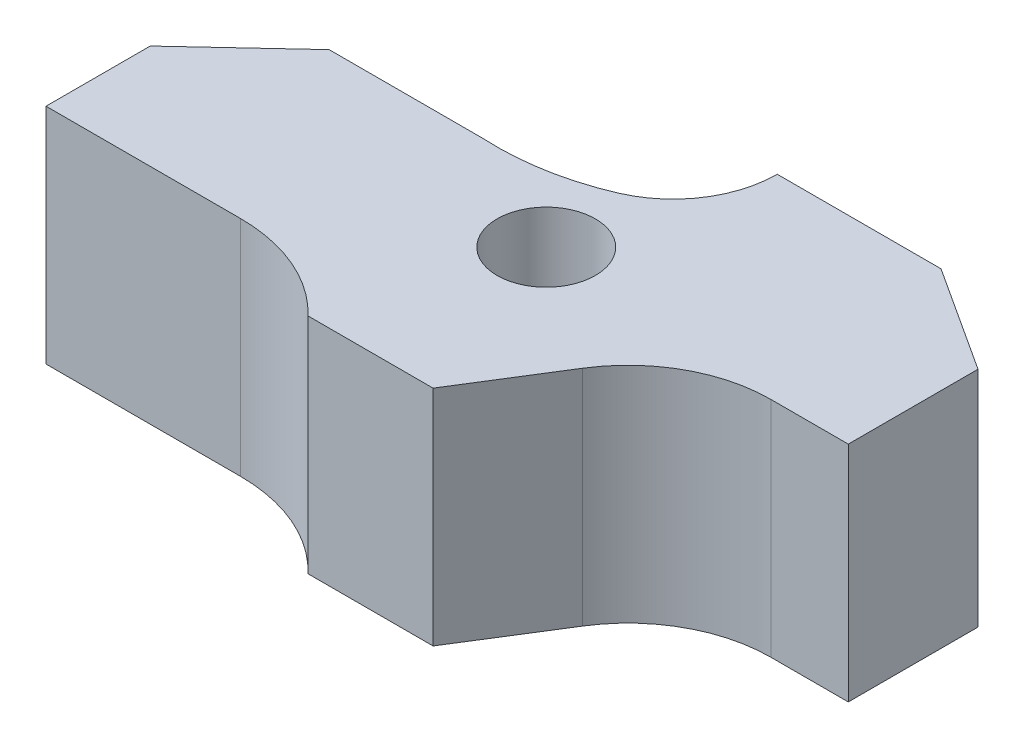
ISO-10303-21;
HEADER;
FILE_DESCRIPTION(('STEP AP214'),'2;1');
FILE_NAME('part.step','',(''),(''),'','','');
FILE_SCHEMA(('AUTOMOTIVE_DESIGN { 1 0 10303 214 1 1 1 1 }'));
ENDSEC;
DATA;
#1=APPLICATION_CONTEXT('core data for automotive mechanical design processes');
#2=APPLICATION_PROTOCOL_DEFINITION('international standard','automotive_design',2000,#1);
#3=PRODUCT_CONTEXT('',#1,'mechanical');
#4=PRODUCT('Part','Part','',(#3));
#5=PRODUCT_RELATED_PRODUCT_CATEGORY('part','',(#4));
#6=PRODUCT_DEFINITION_FORMATION('','',#4);
#7=PRODUCT_DEFINITION_CONTEXT('part definition',#1,'design');
#8=PRODUCT_DEFINITION('design','',#6,#7);
#9=PRODUCT_DEFINITION_SHAPE('','',#8);
#10=(LENGTH_UNIT() NAMED_UNIT(*) SI_UNIT(.MILLI.,.METRE.));
#11=(NAMED_UNIT(*) PLANE_ANGLE_UNIT() SI_UNIT($,.RADIAN.));
#12=(NAMED_UNIT(*) SI_UNIT($,.STERADIAN.) SOLID_ANGLE_UNIT());
#13=UNCERTAINTY_MEASURE_WITH_UNIT(LENGTH_MEASURE(1.E-05),#10,'distance_accuracy_value','');
#14=(GEOMETRIC_REPRESENTATION_CONTEXT(3) GLOBAL_UNCERTAINTY_ASSIGNED_CONTEXT((#13)) GLOBAL_UNIT_ASSIGNED_CONTEXT((#10,
#11,#12)) REPRESENTATION_CONTEXT('',''));
#15=CARTESIAN_POINT('',(0.,0.,0.));
#16=DIRECTION('',(0.,0.,1.));
#17=DIRECTION('',(1.,0.,0.));
#18=AXIS2_PLACEMENT_3D('',#15,#16,#17);
#19=CARTESIAN_POINT('',(87.5332669052182,75.,-149.728715079961));
#20=DIRECTION('',(0.,-1.,0.));
#21=DIRECTION('',(0.,0.,-1.));
#22=AXIS2_PLACEMENT_3D('',#19,#20,#21);
#23=CYLINDRICAL_SURFACE('',#22,85.8484892010049);
#24=CARTESIAN_POINT('',(87.5332669052182,0.,-149.728715079961));
#25=DIRECTION('',(0.,1.,0.));
#26=DIRECTION('',(0.,0.,1.));
#27=AXIS2_PLACEMENT_3D('',#24,#25,#26);
#28=CIRCLE('',#27,85.8484892010049);
#29=CARTESIAN_POINT('',(83.,0.,-64.));
#30=VERTEX_POINT('',#29);
#31=CARTESIAN_POINT('',(121.383798310515,0.,-70.8357203233028));
#32=VERTEX_POINT('',#31);
#33=EDGE_CURVE('E179',#30,#32,#28,.T.);
#34=ORIENTED_EDGE('',*,*,#33,.F.);
#35=DIRECTION('',(0.,-1.,0.));
#36=VECTOR('',#35,1.);
#37=CARTESIAN_POINT('',(83.,75.,-64.));
#38=LINE('',#37,#36);
#39=CARTESIAN_POINT('',(83.,75.,-64.));
#40=VERTEX_POINT('',#39);
#41=EDGE_CURVE('E11',#40,#30,#38,.T.);
#42=ORIENTED_EDGE('',*,*,#41,.F.);
#43=CARTESIAN_POINT('',(87.5332669052182,75.,-149.728715079961));
#44=DIRECTION('',(0.,1.,0.));
#45=DIRECTION('',(0.,0.,1.));
#46=AXIS2_PLACEMENT_3D('',#43,#44,#45);
#47=CIRCLE('',#46,85.8484892010049);
#48=CARTESIAN_POINT('',(121.383798310515,75.,-70.8357203233028));
#49=VERTEX_POINT('',#48);
#50=EDGE_CURVE('E220',#40,#49,#47,.T.);
#51=ORIENTED_EDGE('',*,*,#50,.T.);
#52=DIRECTION('',(0.,-1.,0.));
#53=VECTOR('',#52,1.);
#54=CARTESIAN_POINT('',(121.383798310515,75.,-70.8357203233028));
#55=LINE('',#54,#53);
#56=EDGE_CURVE('E61',#49,#32,#55,.T.);
#57=ORIENTED_EDGE('',*,*,#56,.T.);
#58=EDGE_LOOP('',(#34,#42,#51,#57));
#59=FACE_BOUND('',#58,.T.);
#60=ADVANCED_FACE('F45',(#59),#23,.F.);
#61=CARTESIAN_POINT('',(0.,75.,-64.));
#62=DIRECTION('',(0.,0.,1.));
#63=DIRECTION('',(1.,0.,0.));
#64=AXIS2_PLACEMENT_3D('',#61,#62,#63);
#65=PLANE('',#64);
#66=DIRECTION('',(-1.,0.,0.));
#67=VECTOR('',#66,1.);
#68=CARTESIAN_POINT('',(0.,0.,-64.));
#69=LINE('',#68,#67);
#70=CARTESIAN_POINT('',(31.0986925907159,0.,-64.));
#71=VERTEX_POINT('',#70);
#72=EDGE_CURVE('E181',#30,#71,#69,.T.);
#73=ORIENTED_EDGE('',*,*,#72,.T.);
#74=DIRECTION('',(0.,-1.,0.));
#75=VECTOR('',#74,1.);
#76=CARTESIAN_POINT('',(31.0986925907159,75.,-64.));
#77=LINE('',#76,#75);
#78=CARTESIAN_POINT('',(31.0986925907159,75.,-64.));
#79=VERTEX_POINT('',#78);
#80=EDGE_CURVE('E53',#79,#71,#77,.T.);
#81=ORIENTED_EDGE('',*,*,#80,.F.);
#82=DIRECTION('',(-1.,0.,0.));
#83=VECTOR('',#82,1.);
#84=CARTESIAN_POINT('',(0.,75.,-64.));
#85=LINE('',#84,#83);
#86=EDGE_CURVE('E261',#40,#79,#85,.T.);
#87=ORIENTED_EDGE('',*,*,#86,.F.);
#88=ORIENTED_EDGE('',*,*,#41,.T.);
#89=EDGE_LOOP('',(#73,#81,#87,#88));
#90=FACE_BOUND('',#89,.T.);
#91=ADVANCED_FACE('F248',(#90),#65,.F.);
#92=CARTESIAN_POINT('',(-17.4573708795469,75.,-18.7207382905222));
#93=DIRECTION('',(-0.681998360062497,0.,-0.731353701619171));
#94=DIRECTION('',(-0.731353701619171,0.,0.681998360062497));
#95=AXIS2_PLACEMENT_3D('',#92,#93,#94);
#96=PLANE('',#95);
#97=DIRECTION('',(0.731353701619171,0.,-0.681998360062497));
#98=VECTOR('',#97,1.);
#99=CARTESIAN_POINT('',(-17.4573708795469,0.,-18.7207382905222));
#100=LINE('',#99,#98);
#101=CARTESIAN_POINT('',(0.,0.,-35.));
#102=VERTEX_POINT('',#101);
#103=EDGE_CURVE('E184',#102,#71,#100,.T.);
#104=ORIENTED_EDGE('',*,*,#103,.F.);
#105=DIRECTION('',(0.,-1.,0.));
#106=VECTOR('',#105,1.);
#107=CARTESIAN_POINT('',(0.,75.,-35.));
#108=LINE('',#107,#106);
#109=CARTESIAN_POINT('',(0.,75.,-35.));
#110=VERTEX_POINT('',#109);
#111=EDGE_CURVE('E238',#110,#102,#108,.T.);
#112=ORIENTED_EDGE('',*,*,#111,.F.);
#113=DIRECTION('',(0.731353701619171,0.,-0.681998360062497));
#114=VECTOR('',#113,1.);
#115=CARTESIAN_POINT('',(-17.4573708795469,75.,-18.7207382905222));
#116=LINE('',#115,#114);
#117=EDGE_CURVE('E245',#110,#79,#116,.T.);
#118=ORIENTED_EDGE('',*,*,#117,.T.);
#119=ORIENTED_EDGE('',*,*,#80,.T.);
#120=EDGE_LOOP('',(#104,#112,#118,#119));
#121=FACE_BOUND('',#120,.T.);
#122=ADVANCED_FACE('F243',(#121),#96,.T.);
#123=CARTESIAN_POINT('',(0.,75.,0.));
#124=DIRECTION('',(-1.,0.,0.));
#125=DIRECTION('',(0.,0.,1.));
#126=AXIS2_PLACEMENT_3D('',#123,#124,#125);
#127=PLANE('',#126);
#128=DIRECTION('',(0.,0.,-1.));
#129=VECTOR('',#128,1.);
#130=CARTESIAN_POINT('',(0.,0.,0.));
#131=LINE('',#130,#129);
#132=CARTESIAN_POINT('',(0.,0.,0.));
#133=VERTEX_POINT('',#132);
#134=EDGE_CURVE('E187',#133,#102,#131,.T.);
#135=ORIENTED_EDGE('',*,*,#134,.F.);
#136=DIRECTION('',(0.,-1.,0.));
#137=VECTOR('',#136,1.);
#138=CARTESIAN_POINT('',(0.,75.,0.));
#139=LINE('',#138,#137);
#140=CARTESIAN_POINT('',(0.,75.,0.));
#141=VERTEX_POINT('',#140);
#142=EDGE_CURVE('E236',#141,#133,#139,.T.);
#143=ORIENTED_EDGE('',*,*,#142,.F.);
#144=DIRECTION('',(0.,0.,-1.));
#145=VECTOR('',#144,1.);
#146=CARTESIAN_POINT('',(0.,75.,0.));
#147=LINE('',#146,#145);
#148=EDGE_CURVE('E258',#141,#110,#147,.T.);
#149=ORIENTED_EDGE('',*,*,#148,.T.);
#150=ORIENTED_EDGE('',*,*,#111,.T.);
#151=EDGE_LOOP('',(#135,#143,#149,#150));
#152=FACE_BOUND('',#151,.T.);
#153=ADVANCED_FACE('F255',(#152),#127,.T.);
#154=CARTESIAN_POINT('',(0.,75.,0.));
#155=DIRECTION('',(0.,0.,1.));
#156=DIRECTION('',(1.,0.,0.));
#157=AXIS2_PLACEMENT_3D('',#154,#155,#156);
#158=PLANE('',#157);
#159=DIRECTION('',(-1.,0.,0.));
#160=VECTOR('',#159,1.);
#161=CARTESIAN_POINT('',(0.,0.,0.));
#162=LINE('',#161,#160);
#163=CARTESIAN_POINT('',(65.2382092958579,0.,0.));
#164=VERTEX_POINT('',#163);
#165=EDGE_CURVE('E190',#164,#133,#162,.T.);
#166=ORIENTED_EDGE('',*,*,#165,.F.);
#167=DIRECTION('',(0.,-1.,0.));
#168=VECTOR('',#167,1.);
#169=CARTESIAN_POINT('',(65.2382092958579,75.,0.));
#170=LINE('',#169,#168);
#171=CARTESIAN_POINT('',(65.2382092958579,75.,0.));
#172=VERTEX_POINT('',#171);
#173=EDGE_CURVE('E234',#172,#164,#170,.T.);
#174=ORIENTED_EDGE('',*,*,#173,.F.);
#175=DIRECTION('',(-1.,0.,0.));
#176=VECTOR('',#175,1.);
#177=CARTESIAN_POINT('',(0.,75.,0.));
#178=LINE('',#177,#176);
#179=EDGE_CURVE('E263',#172,#141,#178,.T.);
#180=ORIENTED_EDGE('',*,*,#179,.T.);
#181=ORIENTED_EDGE('',*,*,#142,.T.);
#182=EDGE_LOOP('',(#166,#174,#180,#181));
#183=FACE_BOUND('',#182,.T.);
#184=ADVANCED_FACE('F309',(#183),#158,.T.);
#185=CARTESIAN_POINT('',(65.2382092958579,75.,55.0000000000001));
#186=DIRECTION('',(0.,-1.,0.));
#187=DIRECTION('',(0.,0.,-1.));
#188=AXIS2_PLACEMENT_3D('',#185,#186,#187);
#189=CYLINDRICAL_SURFACE('',#188,55.);
#190=CARTESIAN_POINT('',(65.2382092958579,0.,55.0000000000001));
#191=DIRECTION('',(0.,1.,0.));
#192=DIRECTION('',(0.,0.,1.));
#193=AXIS2_PLACEMENT_3D('',#190,#191,#192);
#194=CIRCLE('',#193,55.);
#195=CARTESIAN_POINT('',(105.,0.,17.));
#196=VERTEX_POINT('',#195);
#197=EDGE_CURVE('E193',#196,#164,#194,.T.);
#198=ORIENTED_EDGE('',*,*,#197,.F.);
#199=DIRECTION('',(0.,-1.,0.));
#200=VECTOR('',#199,1.);
#201=CARTESIAN_POINT('',(105.,75.,17.));
#202=LINE('',#201,#200);
#203=CARTESIAN_POINT('',(105.,75.,17.));
#204=VERTEX_POINT('',#203);
#205=EDGE_CURVE('E232',#204,#196,#202,.T.);
#206=ORIENTED_EDGE('',*,*,#205,.F.);
#207=CARTESIAN_POINT('',(65.2382092958579,75.,55.0000000000001));
#208=DIRECTION('',(0.,1.,0.));
#209=DIRECTION('',(0.,0.,1.));
#210=AXIS2_PLACEMENT_3D('',#207,#208,#209);
#211=CIRCLE('',#210,55.);
#212=EDGE_CURVE('E269',#204,#172,#211,.T.);
#213=ORIENTED_EDGE('',*,*,#212,.T.);
#214=ORIENTED_EDGE('',*,*,#173,.T.);
#215=EDGE_LOOP('',(#198,#206,#213,#214));
#216=FACE_BOUND('',#215,.T.);
#217=ADVANCED_FACE('F312',(#216),#189,.F.);
#218=CARTESIAN_POINT('',(0.,75.,17.));
#219=DIRECTION('',(0.,0.,1.));
#220=DIRECTION('',(1.,0.,0.));
#221=AXIS2_PLACEMENT_3D('',#218,#219,#220);
#222=PLANE('',#221);
#223=DIRECTION('',(-1.,0.,0.));
#224=VECTOR('',#223,1.);
#225=CARTESIAN_POINT('',(0.,0.,17.));
#226=LINE('',#225,#224);
#227=CARTESIAN_POINT('',(147.,0.,17.));
#228=VERTEX_POINT('',#227);
#229=EDGE_CURVE('E196',#228,#196,#226,.T.);
#230=ORIENTED_EDGE('',*,*,#229,.F.);
#231=DIRECTION('',(0.,-1.,0.));
#232=VECTOR('',#231,1.);
#233=CARTESIAN_POINT('',(147.,75.,17.));
#234=LINE('',#233,#232);
#235=CARTESIAN_POINT('',(147.,75.,17.));
#236=VERTEX_POINT('',#235);
#237=EDGE_CURVE('E230',#236,#228,#234,.T.);
#238=ORIENTED_EDGE('',*,*,#237,.F.);
#239=DIRECTION('',(-1.,0.,0.));
#240=VECTOR('',#239,1.);
#241=CARTESIAN_POINT('',(0.,75.,17.));
#242=LINE('',#241,#240);
#243=EDGE_CURVE('E272',#236,#204,#242,.T.);
#244=ORIENTED_EDGE('',*,*,#243,.T.);
#245=ORIENTED_EDGE('',*,*,#205,.T.);
#246=EDGE_LOOP('',(#230,#238,#244,#245));
#247=FACE_BOUND('',#246,.T.);
#248=ADVANCED_FACE('F316',(#247),#222,.T.);
#249=CARTESIAN_POINT('',(113.360028682539,75.,70.8352076552825));
#250=DIRECTION('',(0.84804809615642,0.,0.529919264233214));
#251=DIRECTION('',(0.529919264233214,0.,-0.84804809615642));
#252=AXIS2_PLACEMENT_3D('',#249,#250,#251);
#253=PLANE('',#252);
#254=DIRECTION('',(-0.529919264233214,0.,0.84804809615642));
#255=VECTOR('',#254,1.);
#256=CARTESIAN_POINT('',(113.360028682539,0.,70.8352076552825));
#257=LINE('',#256,#255);
#258=CARTESIAN_POINT('',(166.293691384492,0.,-13.8763605152637));
#259=VERTEX_POINT('',#258);
#260=EDGE_CURVE('E199',#259,#228,#257,.T.);
#261=ORIENTED_EDGE('',*,*,#260,.F.);
#262=DIRECTION('',(0.,-1.,0.));
#263=VECTOR('',#262,1.);
#264=CARTESIAN_POINT('',(166.293691384492,75.,-13.8763605152637));
#265=LINE('',#264,#263);
#266=CARTESIAN_POINT('',(166.293691384492,75.,-13.8763605152637));
#267=VERTEX_POINT('',#266);
#268=EDGE_CURVE('E228',#267,#259,#265,.T.);
#269=ORIENTED_EDGE('',*,*,#268,.F.);
#270=DIRECTION('',(-0.529919264233214,0.,0.84804809615642));
#271=VECTOR('',#270,1.);
#272=CARTESIAN_POINT('',(113.360028682539,75.,70.8352076552825));
#273=LINE('',#272,#271);
#274=EDGE_CURVE('E275',#267,#236,#273,.T.);
#275=ORIENTED_EDGE('',*,*,#274,.T.);
#276=ORIENTED_EDGE('',*,*,#237,.T.);
#277=EDGE_LOOP('',(#261,#269,#275,#276));
#278=FACE_BOUND('',#277,.T.);
#279=ADVANCED_FACE('F320',(#278),#253,.T.);
#280=CARTESIAN_POINT('',(207.,75.,11.5597641679305));
#281=DIRECTION('',(0.,-1.,0.));
#282=DIRECTION('',(0.,0.,-1.));
#283=AXIS2_PLACEMENT_3D('',#280,#281,#282);
#284=CYLINDRICAL_SURFACE('',#283,47.9999999999998);
#285=CARTESIAN_POINT('',(207.,0.,11.5597641679305));
#286=DIRECTION('',(0.,1.,0.));
#287=DIRECTION('',(0.,0.,1.));
#288=AXIS2_PLACEMENT_3D('',#285,#286,#287);
#289=CIRCLE('',#288,47.9999999999998);
#290=CARTESIAN_POINT('',(207.,0.,-36.4402358320693));
#291=VERTEX_POINT('',#290);
#292=EDGE_CURVE('E202',#291,#259,#289,.T.);
#293=ORIENTED_EDGE('',*,*,#292,.F.);
#294=DIRECTION('',(0.,-1.,0.));
#295=VECTOR('',#294,1.);
#296=CARTESIAN_POINT('',(207.,75.,-36.4402358320693));
#297=LINE('',#296,#295);
#298=CARTESIAN_POINT('',(207.,75.,-36.4402358320693));
#299=VERTEX_POINT('',#298);
#300=EDGE_CURVE('E226',#299,#291,#297,.T.);
#301=ORIENTED_EDGE('',*,*,#300,.F.);
#302=CARTESIAN_POINT('',(207.,75.,11.5597641679305));
#303=DIRECTION('',(0.,1.,0.));
#304=DIRECTION('',(0.,0.,1.));
#305=AXIS2_PLACEMENT_3D('',#302,#303,#304);
#306=CIRCLE('',#305,47.9999999999998);
#307=EDGE_CURVE('E278',#299,#267,#306,.T.);
#308=ORIENTED_EDGE('',*,*,#307,.T.);
#309=ORIENTED_EDGE('',*,*,#268,.T.);
#310=EDGE_LOOP('',(#293,#301,#308,#309));
#311=FACE_BOUND('',#310,.T.);
#312=ADVANCED_FACE('F324',(#311),#284,.F.);
#313=CARTESIAN_POINT('',(0.,75.,-36.4402358320693));
#314=DIRECTION('',(0.,0.,1.));
#315=DIRECTION('',(1.,0.,0.));
#316=AXIS2_PLACEMENT_3D('',#313,#314,#315);
#317=PLANE('',#316);
#318=DIRECTION('',(-1.,0.,0.));
#319=VECTOR('',#318,1.);
#320=CARTESIAN_POINT('',(0.,0.,-36.4402358320693));
#321=LINE('',#320,#319);
#322=CARTESIAN_POINT('',(233.,0.,-36.4402358320693));
#323=VERTEX_POINT('',#322);
#324=EDGE_CURVE('E205',#323,#291,#321,.T.);
#325=ORIENTED_EDGE('',*,*,#324,.F.);
#326=DIRECTION('',(0.,-1.,0.));
#327=VECTOR('',#326,1.);
#328=CARTESIAN_POINT('',(233.,75.,-36.4402358320693));
#329=LINE('',#328,#327);
#330=CARTESIAN_POINT('',(233.,75.,-36.4402358320693));
#331=VERTEX_POINT('',#330);
#332=EDGE_CURVE('E224',#331,#323,#329,.T.);
#333=ORIENTED_EDGE('',*,*,#332,.F.);
#334=DIRECTION('',(-1.,0.,0.));
#335=VECTOR('',#334,1.);
#336=CARTESIAN_POINT('',(0.,75.,-36.4402358320693));
#337=LINE('',#336,#335);
#338=EDGE_CURVE('E281',#331,#299,#337,.T.);
#339=ORIENTED_EDGE('',*,*,#338,.T.);
#340=ORIENTED_EDGE('',*,*,#300,.T.);
#341=EDGE_LOOP('',(#325,#333,#339,#340));
#342=FACE_BOUND('',#341,.T.);
#343=ADVANCED_FACE('F328',(#342),#317,.T.);
#344=CARTESIAN_POINT('',(233.,75.,0.));
#345=DIRECTION('',(1.,0.,0.));
#346=DIRECTION('',(0.,0.,-1.));
#347=AXIS2_PLACEMENT_3D('',#344,#345,#346);
#348=PLANE('',#347);
#349=DIRECTION('',(0.,0.,1.));
#350=VECTOR('',#349,1.);
#351=CARTESIAN_POINT('',(233.,0.,0.));
#352=LINE('',#351,#350);
#353=CARTESIAN_POINT('',(233.,0.,-80.));
#354=VERTEX_POINT('',#353);
#355=EDGE_CURVE('E208',#354,#323,#352,.T.);
#356=ORIENTED_EDGE('',*,*,#355,.F.);
#357=DIRECTION('',(0.,-1.,0.));
#358=VECTOR('',#357,1.);
#359=CARTESIAN_POINT('',(233.,75.,-80.));
#360=LINE('',#359,#358);
#361=CARTESIAN_POINT('',(233.,75.,-80.));
#362=VERTEX_POINT('',#361);
#363=EDGE_CURVE('E156',#362,#354,#360,.T.);
#364=ORIENTED_EDGE('',*,*,#363,.F.);
#365=DIRECTION('',(0.,0.,1.));
#366=VECTOR('',#365,1.);
#367=CARTESIAN_POINT('',(233.,75.,0.));
#368=LINE('',#367,#366);
#369=EDGE_CURVE('E168',#362,#331,#368,.T.);
#370=ORIENTED_EDGE('',*,*,#369,.T.);
#371=ORIENTED_EDGE('',*,*,#332,.T.);
#372=EDGE_LOOP('',(#356,#364,#370,#371));
#373=FACE_BOUND('',#372,.T.);
#374=ADVANCED_FACE('F285',(#373),#348,.T.);
#375=CARTESIAN_POINT('',(105.656999387376,75.,-162.697511538395));
#376=DIRECTION('',(0.544639035015037,0.,-0.838670567945418));
#377=DIRECTION('',(-0.838670567945418,0.,-0.544639035015037));
#378=AXIS2_PLACEMENT_3D('',#375,#376,#377);
#379=PLANE('',#378);
#380=DIRECTION('',(0.838670567945418,0.,0.544639035015037));
#381=VECTOR('',#380,1.);
#382=CARTESIAN_POINT('',(105.656999387376,0.,-162.697511538395));
#383=LINE('',#382,#381);
#384=CARTESIAN_POINT('',(197.583105832266,0.,-103.));
#385=VERTEX_POINT('',#384);
#386=EDGE_CURVE('E152',#385,#354,#383,.T.);
#387=ORIENTED_EDGE('',*,*,#386,.F.);
#388=DIRECTION('',(0.,-1.,0.));
#389=VECTOR('',#388,1.);
#390=CARTESIAN_POINT('',(197.583105832266,75.,-103.));
#391=LINE('',#390,#389);
#392=CARTESIAN_POINT('',(197.583105832266,75.,-103.));
#393=VERTEX_POINT('',#392);
#394=EDGE_CURVE('E147',#393,#385,#391,.T.);
#395=ORIENTED_EDGE('',*,*,#394,.F.);
#396=DIRECTION('',(0.838670567945418,0.,0.544639035015037));
#397=VECTOR('',#396,1.);
#398=CARTESIAN_POINT('',(105.656999387376,75.,-162.697511538395));
#399=LINE('',#398,#397);
#400=EDGE_CURVE('E150',#393,#362,#399,.T.);
#401=ORIENTED_EDGE('',*,*,#400,.T.);
#402=ORIENTED_EDGE('',*,*,#363,.T.);
#403=EDGE_LOOP('',(#387,#395,#401,#402));
#404=FACE_BOUND('',#403,.T.);
#405=ADVANCED_FACE('F149',(#404),#379,.T.);
#406=CARTESIAN_POINT('',(0.,75.,-103.));
#407=DIRECTION('',(0.,0.,-1.));
#408=DIRECTION('',(-1.,0.,0.));
#409=AXIS2_PLACEMENT_3D('',#406,#407,#408);
#410=PLANE('',#409);
#411=DIRECTION('',(1.,0.,0.));
#412=VECTOR('',#411,1.);
#413=CARTESIAN_POINT('',(0.,0.,-103.));
#414=LINE('',#413,#412);
#415=CARTESIAN_POINT('',(142.583105832266,0.,-103.));
#416=VERTEX_POINT('',#415);
#417=EDGE_CURVE('E212',#416,#385,#414,.T.);
#418=ORIENTED_EDGE('',*,*,#417,.F.);
#419=DIRECTION('',(0.,-1.,0.));
#420=VECTOR('',#419,1.);
#421=CARTESIAN_POINT('',(142.583105832266,75.,-103.));
#422=LINE('',#421,#420);
#423=CARTESIAN_POINT('',(142.583105832266,75.,-103.));
#424=VERTEX_POINT('',#423);
#425=EDGE_CURVE('E104',#424,#416,#422,.T.);
#426=ORIENTED_EDGE('',*,*,#425,.F.);
#427=DIRECTION('',(1.,0.,0.));
#428=VECTOR('',#427,1.);
#429=CARTESIAN_POINT('',(0.,75.,-103.));
#430=LINE('',#429,#428);
#431=EDGE_CURVE('E165',#424,#393,#430,.T.);
#432=ORIENTED_EDGE('',*,*,#431,.T.);
#433=ORIENTED_EDGE('',*,*,#394,.T.);
#434=EDGE_LOOP('',(#418,#426,#432,#433));
#435=FACE_BOUND('',#434,.T.);
#436=ADVANCED_FACE('F170',(#435),#410,.T.);
#437=CARTESIAN_POINT('',(107.583105832265,75.,-103.));
#438=DIRECTION('',(0.,-1.,0.));
#439=DIRECTION('',(0.,0.,-1.));
#440=AXIS2_PLACEMENT_3D('',#437,#438,#439);
#441=CYLINDRICAL_SURFACE('',#440,35.0000000000001);
#442=CARTESIAN_POINT('',(107.583105832265,0.,-103.));
#443=DIRECTION('',(0.,1.,0.));
#444=DIRECTION('',(0.,0.,1.));
#445=AXIS2_PLACEMENT_3D('',#442,#443,#444);
#446=CIRCLE('',#445,35.0000000000001);
#447=EDGE_CURVE('E214',#32,#416,#446,.T.);
#448=ORIENTED_EDGE('',*,*,#447,.F.);
#449=ORIENTED_EDGE('',*,*,#56,.F.);
#450=CARTESIAN_POINT('',(107.583105832265,75.,-103.));
#451=DIRECTION('',(0.,1.,0.));
#452=DIRECTION('',(0.,0.,1.));
#453=AXIS2_PLACEMENT_3D('',#450,#451,#452);
#454=CIRCLE('',#453,35.0000000000001);
#455=EDGE_CURVE('E171',#49,#424,#454,.T.);
#456=ORIENTED_EDGE('',*,*,#455,.T.);
#457=ORIENTED_EDGE('',*,*,#425,.T.);
#458=EDGE_LOOP('',(#448,#449,#456,#457));
#459=FACE_BOUND('',#458,.T.);
#460=ADVANCED_FACE('F287',(#459),#441,.F.);
#461=CARTESIAN_POINT('',(125.,75.,-43.));
#462=DIRECTION('',(0.,-1.,0.));
#463=DIRECTION('',(0.,0.,-1.));
#464=AXIS2_PLACEMENT_3D('',#461,#462,#463);
#465=CYLINDRICAL_SURFACE('',#464,16.5);
#466=CARTESIAN_POINT('',(125.,75.,-43.));
#467=DIRECTION('',(0.,1.,0.));
#468=DIRECTION('',(0.,0.,1.));
#469=AXIS2_PLACEMENT_3D('',#466,#467,#468);
#470=CIRCLE('',#469,16.5);
#471=CARTESIAN_POINT('',(125.,75.,-26.5));
#472=VERTEX_POINT('',#471);
#473=EDGE_CURVE('E173',#472,#472,#470,.T.);
#474=ORIENTED_EDGE('',*,*,#473,.T.);
#475=EDGE_LOOP('',(#474));
#476=FACE_BOUND('',#475,.T.);
#477=CARTESIAN_POINT('',(125.,0.,-43.));
#478=DIRECTION('',(0.,1.,0.));
#479=DIRECTION('',(0.,0.,1.));
#480=AXIS2_PLACEMENT_3D('',#477,#478,#479);
#481=CIRCLE('',#480,16.5);
#482=CARTESIAN_POINT('',(125.,0.,-26.5));
#483=VERTEX_POINT('',#482);
#484=EDGE_CURVE('E217',#483,#483,#481,.T.);
#485=ORIENTED_EDGE('',*,*,#484,.F.);
#486=EDGE_LOOP('',(#485));
#487=FACE_BOUND('',#486,.T.);
#488=ADVANCED_FACE('F289',(#476,#487),#465,.F.);
#489=CARTESIAN_POINT('',(0.,75.,0.));
#490=DIRECTION('',(0.,1.,0.));
#491=DIRECTION('',(0.,0.,1.));
#492=AXIS2_PLACEMENT_3D('',#489,#490,#491);
#493=PLANE('',#492);
#494=ORIENTED_EDGE('',*,*,#50,.F.);
#495=ORIENTED_EDGE('',*,*,#86,.T.);
#496=ORIENTED_EDGE('',*,*,#117,.F.);
#497=ORIENTED_EDGE('',*,*,#148,.F.);
#498=ORIENTED_EDGE('',*,*,#179,.F.);
#499=ORIENTED_EDGE('',*,*,#212,.F.);
#500=ORIENTED_EDGE('',*,*,#243,.F.);
#501=ORIENTED_EDGE('',*,*,#274,.F.);
#502=ORIENTED_EDGE('',*,*,#307,.F.);
#503=ORIENTED_EDGE('',*,*,#338,.F.);
#504=ORIENTED_EDGE('',*,*,#369,.F.);
#505=ORIENTED_EDGE('',*,*,#400,.F.);
#506=ORIENTED_EDGE('',*,*,#431,.F.);
#507=ORIENTED_EDGE('',*,*,#455,.F.);
#508=EDGE_LOOP('',(#494,#495,#496,#497,#498,#499,#500,#501,#502,#503,#504,#505,#506,#507));
#509=FACE_BOUND('',#508,.T.);
#510=ORIENTED_EDGE('',*,*,#473,.F.);
#511=EDGE_LOOP('',(#510));
#512=FACE_BOUND('',#511,.T.);
#513=ADVANCED_FACE('F162',(#509,#512),#493,.T.);
#514=CARTESIAN_POINT('',(0.,0.,0.));
#515=DIRECTION('',(0.,1.,0.));
#516=DIRECTION('',(0.,0.,1.));
#517=AXIS2_PLACEMENT_3D('',#514,#515,#516);
#518=PLANE('',#517);
#519=ORIENTED_EDGE('',*,*,#33,.T.);
#520=ORIENTED_EDGE('',*,*,#447,.T.);
#521=ORIENTED_EDGE('',*,*,#417,.T.);
#522=ORIENTED_EDGE('',*,*,#386,.T.);
#523=ORIENTED_EDGE('',*,*,#355,.T.);
#524=ORIENTED_EDGE('',*,*,#324,.T.);
#525=ORIENTED_EDGE('',*,*,#292,.T.);
#526=ORIENTED_EDGE('',*,*,#260,.T.);
#527=ORIENTED_EDGE('',*,*,#229,.T.);
#528=ORIENTED_EDGE('',*,*,#197,.T.);
#529=ORIENTED_EDGE('',*,*,#165,.T.);
#530=ORIENTED_EDGE('',*,*,#134,.T.);
#531=ORIENTED_EDGE('',*,*,#103,.T.);
#532=ORIENTED_EDGE('',*,*,#72,.F.);
#533=EDGE_LOOP('',(#519,#520,#521,#522,#523,#524,#525,#526,#527,#528,#529,#530,#531,#532));
#534=FACE_BOUND('',#533,.T.);
#535=ORIENTED_EDGE('',*,*,#484,.T.);
#536=EDGE_LOOP('',(#535));
#537=FACE_BOUND('',#536,.T.);
#538=ADVANCED_FACE('F250',(#534,#537),#518,.F.);
#539=CLOSED_SHELL('',(#60,#91,#122,#153,#184,#217,#248,#279,#312,#343,#374,#405,#436,#460,#488,
#513,#538));
#540=MANIFOLD_SOLID_BREP('B2',#539);
#541=ADVANCED_BREP_SHAPE_REPRESENTATION('',(#18,#540),#14);
#542=SHAPE_DEFINITION_REPRESENTATION(#9,#541);
ENDSEC;
END-ISO-10303-21;
